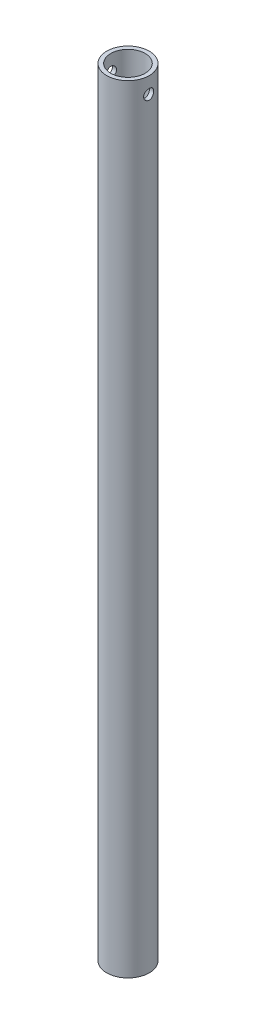
ISO-10303-21;
HEADER;
FILE_DESCRIPTION(('STEP AP214'),'2;1');
FILE_NAME('part.step','',(''),(''),'','','');
FILE_SCHEMA(('AUTOMOTIVE_DESIGN { 1 0 10303 214 1 1 1 1 }'));
ENDSEC;
DATA;
#1=APPLICATION_CONTEXT('core data for automotive mechanical design processes');
#2=APPLICATION_PROTOCOL_DEFINITION('international standard','automotive_design',2000,#1);
#3=PRODUCT_CONTEXT('',#1,'mechanical');
#4=PRODUCT('Part','Part','',(#3));
#5=PRODUCT_RELATED_PRODUCT_CATEGORY('part','',(#4));
#6=PRODUCT_DEFINITION_FORMATION('','',#4);
#7=PRODUCT_DEFINITION_CONTEXT('part definition',#1,'design');
#8=PRODUCT_DEFINITION('design','',#6,#7);
#9=PRODUCT_DEFINITION_SHAPE('','',#8);
#10=(LENGTH_UNIT() NAMED_UNIT(*) SI_UNIT(.MILLI.,.METRE.));
#11=(NAMED_UNIT(*) PLANE_ANGLE_UNIT() SI_UNIT($,.RADIAN.));
#12=(NAMED_UNIT(*) SI_UNIT($,.STERADIAN.) SOLID_ANGLE_UNIT());
#13=UNCERTAINTY_MEASURE_WITH_UNIT(LENGTH_MEASURE(1.E-05),#10,'distance_accuracy_value','');
#14=(GEOMETRIC_REPRESENTATION_CONTEXT(3) GLOBAL_UNCERTAINTY_ASSIGNED_CONTEXT((#13)) GLOBAL_UNIT_ASSIGNED_CONTEXT((#10,
#11,#12)) REPRESENTATION_CONTEXT('',''));
#15=CARTESIAN_POINT('',(0.,0.,0.));
#16=DIRECTION('',(0.,0.,1.));
#17=DIRECTION('',(1.,0.,0.));
#18=AXIS2_PLACEMENT_3D('',#15,#16,#17);
#19=CARTESIAN_POINT('',(0.,609.6,0.));
#20=DIRECTION('',(0.,-1.,0.));
#21=DIRECTION('',(0.,0.,-1.));
#22=AXIS2_PLACEMENT_3D('',#19,#20,#21);
#23=CYLINDRICAL_SURFACE('',#22,16.66875);
#24=CARTESIAN_POINT('',(0.,609.6,0.));
#25=DIRECTION('',(0.,1.,0.));
#26=DIRECTION('',(0.,0.,1.));
#27=AXIS2_PLACEMENT_3D('',#24,#25,#26);
#28=CIRCLE('',#27,16.66875);
#29=CARTESIAN_POINT('',(0.,609.6,16.66875));
#30=VERTEX_POINT('',#29);
#31=EDGE_CURVE('E10',#30,#30,#28,.T.);
#32=ORIENTED_EDGE('',*,*,#31,.F.);
#33=EDGE_LOOP('',(#32));
#34=FACE_BOUND('',#33,.T.);
#35=CARTESIAN_POINT('',(0.,0.,0.));
#36=DIRECTION('',(0.,1.,0.));
#37=DIRECTION('',(0.,0.,1.));
#38=AXIS2_PLACEMENT_3D('',#35,#36,#37);
#39=CIRCLE('',#38,16.66875);
#40=CARTESIAN_POINT('',(0.,0.,16.66875));
#41=VERTEX_POINT('',#40);
#42=EDGE_CURVE('E44',#41,#41,#39,.T.);
#43=ORIENTED_EDGE('',*,*,#42,.T.);
#44=EDGE_LOOP('',(#43));
#45=FACE_BOUND('',#44,.T.);
#46=CARTESIAN_POINT('',(-16.1893869556571,596.9,3.96874999999999));
#47=CARTESIAN_POINT('',(-16.1893913039694,597.119509138966,3.96874320187447));
#48=CARTESIAN_POINT('',(-16.193900092601,597.339095949009,3.95047662095431));
#49=CARTESIAN_POINT('',(-16.2114072036727,597.771987990475,3.87799482760028));
#50=CARTESIAN_POINT('',(-16.224410936394,597.985289128122,3.82375670518668));
#51=CARTESIAN_POINT('',(-16.2573535939761,598.399285688146,3.68116696825289));
#52=CARTESIAN_POINT('',(-16.277284097737,598.599996069328,3.59285676197682));
#53=CARTESIAN_POINT('',(-16.3218243007466,598.983767714436,3.38475299203812));
#54=CARTESIAN_POINT('',(-16.3464340837801,599.166828662252,3.26495886462595));
#55=CARTESIAN_POINT('',(-16.3981099437525,599.513762959826,2.99473337212103));
#56=CARTESIAN_POINT('',(-16.4252122416785,599.677231928507,2.84378966404885));
#57=CARTESIAN_POINT('',(-16.4785040589715,599.976787749384,2.5166543345214));
#58=CARTESIAN_POINT('',(-16.5046934987564,600.112872219135,2.34046051859421));
#59=CARTESIAN_POINT('',(-16.5536070855652,600.355428976585,1.96507927258675));
#60=CARTESIAN_POINT('',(-16.5762835021716,600.461507267769,1.76563050089719));
#61=CARTESIAN_POINT('',(-16.6152044070171,600.638483800886,1.35110443367567));
#62=CARTESIAN_POINT('',(-16.6314497535651,600.709386737743,1.1360292282298));
#63=CARTESIAN_POINT('',(-16.6554220885956,600.812713838594,0.700567166830818));
#64=CARTESIAN_POINT('',(-16.663300720919,600.84582384611,0.480351539849617));
#65=CARTESIAN_POINT('',(-16.6701791620199,600.874774685706,0.0373599159719877));
#66=CARTESIAN_POINT('',(-16.66918016612,600.870620535193,-0.185415732198095));
#67=CARTESIAN_POINT('',(-16.6585299872047,600.825661197348,-0.622458310421993));
#68=CARTESIAN_POINT('',(-16.6490534720449,600.785595879071,-0.836806243483198));
#69=CARTESIAN_POINT('',(-16.622714647105,600.671136698666,-1.25564506631625));
#70=CARTESIAN_POINT('',(-16.6058519657883,600.596741109658,-1.46013545966272));
#71=CARTESIAN_POINT('',(-16.566362857535,600.415112762414,-1.85544493993857));
#72=CARTESIAN_POINT('',(-16.5436893002388,600.30760997042,-2.04613505635982));
#73=CARTESIAN_POINT('',(-16.4950486784818,600.063022206679,-2.40703224887773));
#74=CARTESIAN_POINT('',(-16.4690810895867,599.925932522034,-2.57723605497414));
#75=CARTESIAN_POINT('',(-16.4159388375055,599.622071165898,-2.89673765614987));
#76=CARTESIAN_POINT('',(-16.3887501944136,599.454652417083,-3.04541833943176));
#77=CARTESIAN_POINT('',(-16.336820050432,599.096973391909,-3.31272277423931));
#78=CARTESIAN_POINT('',(-16.3120786432218,598.906712241766,-3.43134537542204));
#79=CARTESIAN_POINT('',(-16.2677989475134,598.50762365026,-3.63551269800721));
#80=CARTESIAN_POINT('',(-16.2482821219223,598.298724185156,-3.72092160620989));
#81=CARTESIAN_POINT('',(-16.2169441914395,597.868958142799,-3.85522429075744));
#82=CARTESIAN_POINT('',(-16.2051216115953,597.648093867946,-3.90412506581322));
#83=CARTESIAN_POINT('',(-16.1908170049581,597.20635758429,-3.96302610438424));
#84=CARTESIAN_POINT('',(-16.188117255765,596.985613413373,-3.97393330883585));
#85=CARTESIAN_POINT('',(-16.1917734400006,596.545460070858,-3.95900969993296));
#86=CARTESIAN_POINT('',(-16.1981286250799,596.326050790442,-3.93318192255887));
#87=CARTESIAN_POINT('',(-16.218971150064,595.898079290154,-3.84631356280958));
#88=CARTESIAN_POINT('',(-16.2333390904376,595.689405839453,-3.78578963251961));
#89=CARTESIAN_POINT('',(-16.2684770960753,595.285164038621,-3.63181448734691));
#90=CARTESIAN_POINT('',(-16.2892478640847,595.089597129873,-3.53835965795668));
#91=CARTESIAN_POINT('',(-16.33531744805,594.71324455203,-3.31923808079745));
#92=CARTESIAN_POINT('',(-16.3606909366282,594.532787717412,-3.19302258008508));
#93=CARTESIAN_POINT('',(-16.4129185095009,594.195282064995,-2.91266576127535));
#94=CARTESIAN_POINT('',(-16.4397728130794,594.038236726871,-2.75852029944565));
#95=CARTESIAN_POINT('',(-16.4926661509835,593.748399144301,-2.42253961732193));
#96=CARTESIAN_POINT('',(-16.5186733327086,593.616230768001,-2.2401602957868));
#97=CARTESIAN_POINT('',(-16.5663141058592,593.384402070726,-1.85526550103091));
#98=CARTESIAN_POINT('',(-16.5879479182715,593.284740107043,-1.65275104601206));
#99=CARTESIAN_POINT('',(-16.6242723128625,593.121575254231,-1.23469355882788));
#100=CARTESIAN_POINT('',(-16.6390107582733,593.057822456165,-1.0192524166005));
#101=CARTESIAN_POINT('',(-16.6600923892765,592.967521897732,-0.580321227017824));
#102=CARTESIAN_POINT('',(-16.6664370352183,592.940967665528,-0.356832586714426));
#103=CARTESIAN_POINT('',(-16.6699629861333,592.926153479183,0.0859651670735121));
#104=CARTESIAN_POINT('',(-16.6673655804266,592.936968764477,0.305242073104256));
#105=CARTESIAN_POINT('',(-16.6537834215515,592.99448811683,0.738757658403146));
#106=CARTESIAN_POINT('',(-16.642798876678,593.041191292611,0.952996462656539));
#107=CARTESIAN_POINT('',(-16.6137040048459,593.168684580464,1.3694855791003));
#108=CARTESIAN_POINT('',(-16.5956257128625,593.249321566301,1.5717851479128));
#109=CARTESIAN_POINT('',(-16.554257106068,593.442251681583,1.96009471458966));
#110=CARTESIAN_POINT('',(-16.5309661903573,593.554548461088,2.14610283096938));
#111=CARTESIAN_POINT('',(-16.4810542350619,593.810507998869,2.50098557153082));
#112=CARTESIAN_POINT('',(-16.4543711158269,593.954807485788,2.66939224485944));
#113=CARTESIAN_POINT('',(-16.4009820273245,594.269420806537,2.97991533377172));
#114=CARTESIAN_POINT('',(-16.3742760540323,594.439741080837,3.12202522126325));
#115=CARTESIAN_POINT('',(-16.3233674418405,594.804943623025,3.37820724795554));
#116=CARTESIAN_POINT('',(-16.2992133728001,595.000184761318,3.49177813155239));
#117=CARTESIAN_POINT('',(-16.2567784368234,595.407529441332,3.68431435823782));
#118=CARTESIAN_POINT('',(-16.2384930181336,595.619619754686,3.7633065381268));
#119=CARTESIAN_POINT('',(-16.2129336405371,596.009654634087,3.87174406553944));
#120=CARTESIAN_POINT('',(-16.2041668827364,596.185626857772,3.9080458952094));
#121=CARTESIAN_POINT('',(-16.192391961351,596.541048902203,3.95655080941673));
#122=CARTESIAN_POINT('',(-16.1893833998659,596.720498481794,3.96875555910271));
#123=CARTESIAN_POINT('',(-16.1893869556571,596.9,3.96874999999999));
#124=B_SPLINE_CURVE_WITH_KNOTS('',3,(#46,#47,#48,#49,#50,#51,#52,#53,#54,#55,#56,#57,#58,#59,
#60,#61,#62,#63,#64,#65,#66,#67,#68,#69,#70,#71,#72,#73,#74,#75,#76,#77,#78,#79,#80,#81,#82,#83,
#84,#85,#86,#87,#88,#89,#90,#91,#92,#93,#94,#95,#96,#97,#98,#99,#100,#101,#102,#103,#104,#105,
#106,#107,#108,#109,#110,#111,#112,#113,#114,#115,#116,#117,#118,#119,#120,#121,#122,#123),
.UNSPECIFIED.,.T.,.F.,(4,2,2,2,2,2,2,2,2,2,2,2,2,2,2,2,2,2,2,2,2,2,2,2,2,2,2,2,2,2,2,2,2,2,2,2,
2,2,4),(0.,0.657868779461489,1.316156953031,1.97364760776035,2.63115003628708,3.30047966623595,
3.96986750254462,4.64767500234941,5.32539200951323,5.99060427426692,6.65572697329564,
7.30745352003919,7.95921285349548,8.61643563569944,9.27376318428535,9.94725702561397,
10.6207766381115,11.297022067479,11.9731378254006,12.632999141662,13.2928059265329,
13.9430338419582,14.5933331488789,15.255320211521,15.9174055681281,16.5943597100004,
17.2712796367647,17.9434284289527,18.6154602656206,19.2709820870444,19.9264876290886,
20.5790663962662,21.2317204300525,21.898758265315,22.5659614690678,23.2441723705682,
23.9218559700471,24.4598591083636,24.9978250684599),.UNSPECIFIED.);
#125=CARTESIAN_POINT('',(-16.1893869556571,596.9,3.96874999999999));
#126=VERTEX_POINT('',#125);
#127=EDGE_CURVE('E72',#126,#126,#124,.T.);
#128=ORIENTED_EDGE('',*,*,#127,.F.);
#129=EDGE_LOOP('',(#128));
#130=FACE_BOUND('',#129,.T.);
#131=CARTESIAN_POINT('',(16.1893869556571,596.9,3.96874999999999));
#132=CARTESIAN_POINT('',(16.1893913039694,596.680490861034,3.96874320187447));
#133=CARTESIAN_POINT('',(16.193900092601,596.460904050991,3.95047662095431));
#134=CARTESIAN_POINT('',(16.2114072036728,596.028012009525,3.87799482760028));
#135=CARTESIAN_POINT('',(16.224410936394,595.814710871878,3.82375670518668));
#136=CARTESIAN_POINT('',(16.2573535939761,595.400714311854,3.68116696825289));
#137=CARTESIAN_POINT('',(16.277284097737,595.200003930672,3.59285676197682));
#138=CARTESIAN_POINT('',(16.3218243007466,594.816232285564,3.38475299203812));
#139=CARTESIAN_POINT('',(16.3464340837801,594.633171337748,3.26495886462595));
#140=CARTESIAN_POINT('',(16.3981099437525,594.286237040174,2.99473337212103));
#141=CARTESIAN_POINT('',(16.4252122416785,594.122768071493,2.84378966404885));
#142=CARTESIAN_POINT('',(16.4785040589715,593.823212250616,2.5166543345214));
#143=CARTESIAN_POINT('',(16.5046934987564,593.687127780865,2.34046051859421));
#144=CARTESIAN_POINT('',(16.5536070855652,593.444571023415,1.96507927258675));
#145=CARTESIAN_POINT('',(16.5762835021716,593.338492732231,1.76563050089719));
#146=CARTESIAN_POINT('',(16.6152044070171,593.161516199114,1.35110443367567));
#147=CARTESIAN_POINT('',(16.6314497535651,593.090613262257,1.1360292282298));
#148=CARTESIAN_POINT('',(16.6554220885956,592.987286161406,0.700567166830818));
#149=CARTESIAN_POINT('',(16.663300720919,592.95417615389,0.480351539849617));
#150=CARTESIAN_POINT('',(16.6701791620199,592.925225314294,0.0373599159719883));
#151=CARTESIAN_POINT('',(16.66918016612,592.929379464807,-0.185415732198094));
#152=CARTESIAN_POINT('',(16.6585299872047,592.974338802651,-0.622458310421993));
#153=CARTESIAN_POINT('',(16.6490534720449,593.014404120929,-0.836806243483198));
#154=CARTESIAN_POINT('',(16.622714647105,593.128863301334,-1.25564506631625));
#155=CARTESIAN_POINT('',(16.6058519657883,593.203258890342,-1.46013545966272));
#156=CARTESIAN_POINT('',(16.566362857535,593.384887237586,-1.85544493993857));
#157=CARTESIAN_POINT('',(16.5436893002388,593.49239002958,-2.04613505635982));
#158=CARTESIAN_POINT('',(16.4950486784818,593.736977793321,-2.40703224887773));
#159=CARTESIAN_POINT('',(16.4690810895867,593.874067477965,-2.57723605497414));
#160=CARTESIAN_POINT('',(16.4159388375055,594.177928834102,-2.89673765614987));
#161=CARTESIAN_POINT('',(16.3887501944136,594.345347582917,-3.04541833943176));
#162=CARTESIAN_POINT('',(16.336820050432,594.703026608091,-3.31272277423931));
#163=CARTESIAN_POINT('',(16.3120786432218,594.893287758234,-3.43134537542204));
#164=CARTESIAN_POINT('',(16.2677989475134,595.29237634974,-3.63551269800722));
#165=CARTESIAN_POINT('',(16.2482821219223,595.501275814844,-3.72092160620992));
#166=CARTESIAN_POINT('',(16.2169441914395,595.931041857201,-3.85522429075746));
#167=CARTESIAN_POINT('',(16.2051216115953,596.151906132054,-3.90412506581323));
#168=CARTESIAN_POINT('',(16.1908170049581,596.59364241571,-3.96302610438424));
#169=CARTESIAN_POINT('',(16.188117255765,596.814386586627,-3.97393330883585));
#170=CARTESIAN_POINT('',(16.1917734400006,597.254539929142,-3.95900969993296));
#171=CARTESIAN_POINT('',(16.1981286250799,597.473949209558,-3.93318192255887));
#172=CARTESIAN_POINT('',(16.218971150064,597.901920709846,-3.84631356280957));
#173=CARTESIAN_POINT('',(16.2333390904376,598.110594160547,-3.78578963251959));
#174=CARTESIAN_POINT('',(16.2684770960753,598.514835961379,-3.63181448734688));
#175=CARTESIAN_POINT('',(16.2892478640847,598.710402870127,-3.53835965795666));
#176=CARTESIAN_POINT('',(16.33531744805,599.08675544797,-3.31923808079744));
#177=CARTESIAN_POINT('',(16.3606909366282,599.267212282588,-3.19302258008508));
#178=CARTESIAN_POINT('',(16.4129185095009,599.604717935005,-2.91266576127535));
#179=CARTESIAN_POINT('',(16.4397728130794,599.761763273129,-2.75852029944565));
#180=CARTESIAN_POINT('',(16.4926661509835,600.051600855699,-2.42253961732193));
#181=CARTESIAN_POINT('',(16.5186733327086,600.183769231999,-2.2401602957868));
#182=CARTESIAN_POINT('',(16.5663141058592,600.415597929274,-1.85526550103091));
#183=CARTESIAN_POINT('',(16.5879479182715,600.515259892957,-1.65275104601206));
#184=CARTESIAN_POINT('',(16.6242723128625,600.678424745769,-1.23469355882788));
#185=CARTESIAN_POINT('',(16.6390107582733,600.742177543835,-1.0192524166005));
#186=CARTESIAN_POINT('',(16.6600923892765,600.832478102268,-0.580321227017824));
#187=CARTESIAN_POINT('',(16.6664370352183,600.859032334472,-0.356832586714425));
#188=CARTESIAN_POINT('',(16.6699629861333,600.873846520817,0.0859651670735123));
#189=CARTESIAN_POINT('',(16.6673655804266,600.863031235523,0.305242073104256));
#190=CARTESIAN_POINT('',(16.6537834215515,600.80551188317,0.738757658403146));
#191=CARTESIAN_POINT('',(16.642798876678,600.758808707389,0.952996462656539));
#192=CARTESIAN_POINT('',(16.6137040048459,600.631315419536,1.3694855791003));
#193=CARTESIAN_POINT('',(16.5956257128625,600.550678433699,1.5717851479128));
#194=CARTESIAN_POINT('',(16.554257106068,600.357748318416,1.96009471458966));
#195=CARTESIAN_POINT('',(16.5309661903573,600.245451538912,2.14610283096938));
#196=CARTESIAN_POINT('',(16.4810542350619,599.989492001131,2.50098557153082));
#197=CARTESIAN_POINT('',(16.4543711158269,599.845192514212,2.66939224485944));
#198=CARTESIAN_POINT('',(16.4009820273245,599.530579193463,2.97991533377172));
#199=CARTESIAN_POINT('',(16.3742760540323,599.360258919163,3.12202522126325));
#200=CARTESIAN_POINT('',(16.3233674418405,598.995056376975,3.37820724795554));
#201=CARTESIAN_POINT('',(16.2992133728001,598.799815238682,3.49177813155239));
#202=CARTESIAN_POINT('',(16.2567784368234,598.392470558668,3.68431435823782));
#203=CARTESIAN_POINT('',(16.2384930181336,598.180380245314,3.7633065381268));
#204=CARTESIAN_POINT('',(16.2129336405371,597.790345365913,3.87174406553943));
#205=CARTESIAN_POINT('',(16.2041668827364,597.614373142228,3.90804589520939));
#206=CARTESIAN_POINT('',(16.192391961351,597.258951097797,3.95655080941672));
#207=CARTESIAN_POINT('',(16.1893833998659,597.079501518206,3.96875555910271));
#208=CARTESIAN_POINT('',(16.1893869556571,596.9,3.96874999999999));
#209=B_SPLINE_CURVE_WITH_KNOTS('',3,(#131,#132,#133,#134,#135,#136,#137,#138,#139,#140,#141,
#142,#143,#144,#145,#146,#147,#148,#149,#150,#151,#152,#153,#154,#155,#156,#157,#158,#159,#160,
#161,#162,#163,#164,#165,#166,#167,#168,#169,#170,#171,#172,#173,#174,#175,#176,#177,#178,#179,
#180,#181,#182,#183,#184,#185,#186,#187,#188,#189,#190,#191,#192,#193,#194,#195,#196,#197,#198,
#199,#200,#201,#202,#203,#204,#205,#206,#207,#208),.UNSPECIFIED.,.T.,.F.,(4,2,2,2,2,2,2,2,2,2,2,
2,2,2,2,2,2,2,2,2,2,2,2,2,2,2,2,2,2,2,2,2,2,2,2,2,2,2,4),(0.,0.657868779461489,1.316156953031,
1.97364760776035,2.63115003628708,3.30047966623595,3.96986750254462,4.64767500234941,
5.32539200951323,5.99060427426692,6.65572697329564,7.30745352003919,7.95921285349548,
8.61643563569944,9.27376318428535,9.94725702561397,10.6207766381115,11.2970220674791,
11.9731378254006,12.6329991416619,13.2928059265329,13.9430338419583,14.5933331488789,
15.255320211521,15.9174055681281,16.5943597100004,17.2712796367647,17.9434284289527,
18.6154602656206,19.2709820870444,19.9264876290886,20.5790663962662,21.2317204300525,
21.898758265315,22.5659614690678,23.2441723705682,23.9218559700471,24.4598591083634,
24.9978250684599),.UNSPECIFIED.);
#210=CARTESIAN_POINT('',(16.1893869556571,596.9,3.96874999999999));
#211=VERTEX_POINT('',#210);
#212=EDGE_CURVE('E77',#211,#211,#209,.T.);
#213=ORIENTED_EDGE('',*,*,#212,.F.);
#214=EDGE_LOOP('',(#213));
#215=FACE_BOUND('',#214,.T.);
#216=ADVANCED_FACE('F31',(#34,#45,#130,#215),#23,.T.);
#217=CARTESIAN_POINT('',(0.,609.6,0.));
#218=DIRECTION('',(0.,-1.,0.));
#219=DIRECTION('',(0.,0.,-1.));
#220=AXIS2_PLACEMENT_3D('',#217,#218,#219);
#221=CYLINDRICAL_SURFACE('',#220,13.49375);
#222=CARTESIAN_POINT('',(-12.8969109673596,596.9,3.96874999999999));
#223=CARTESIAN_POINT('',(-12.8969135757376,597.117687758627,3.96874676525359));
#224=CARTESIAN_POINT('',(-12.9024828229111,597.335407716338,3.95077864824026));
#225=CARTESIAN_POINT('',(-12.9240733024968,597.764496646878,3.87955690784989));
#226=CARTESIAN_POINT('',(-12.9400983406899,597.975863277857,3.82629043619005));
#227=CARTESIAN_POINT('',(-12.980631856942,598.385972765027,3.68642561256911));
#228=CARTESIAN_POINT('',(-13.0051266268461,598.584735409197,3.59988109550326));
#229=CARTESIAN_POINT('',(-13.0598213153262,598.964966077318,3.39609239059901));
#230=CARTESIAN_POINT('',(-13.090022015077,599.146431728088,3.2788439983734));
#231=CARTESIAN_POINT('',(-13.1537558286523,599.492436858201,3.01315822457902));
#232=CARTESIAN_POINT('',(-13.187357820376,599.656372412924,2.86395069232767));
#233=CARTESIAN_POINT('',(-13.2535186381234,599.957292343641,2.54023364484507));
#234=CARTESIAN_POINT('',(-13.2860773347162,600.094273386423,2.3657210049963));
#235=CARTESIAN_POINT('',(-13.3472629405691,600.339999083879,1.99207127191436));
#236=CARTESIAN_POINT('',(-13.3757992118533,600.448130799517,1.79251494808595));
#237=CARTESIAN_POINT('',(-13.4249262983536,600.629069063295,1.37706994878709));
#238=CARTESIAN_POINT('',(-13.4455187571649,600.701882919593,1.16118466288854));
#239=CARTESIAN_POINT('',(-13.4759507145952,600.808128098014,0.725525609268526));
#240=CARTESIAN_POINT('',(-13.4860709604196,600.842589631708,0.506023044797725));
#241=CARTESIAN_POINT('',(-13.4954055960329,600.87440646271,0.0641340385014437));
#242=CARTESIAN_POINT('',(-13.4946221904556,600.871769261094,-0.158251811261482));
#243=CARTESIAN_POINT('',(-13.4824375849886,600.830161274496,-0.592377756116062));
#244=CARTESIAN_POINT('',(-13.4713622731322,600.792305621884,-0.804235308489671));
#245=CARTESIAN_POINT('',(-13.4402322141025,600.68315318123,-1.21844568788541));
#246=CARTESIAN_POINT('',(-13.4201769070886,600.611854308221,-1.42079792144759));
#247=CARTESIAN_POINT('',(-13.3728837518511,600.437066283411,-1.81294025792372));
#248=CARTESIAN_POINT('',(-13.3455669130679,600.333220719208,-2.00256157976797));
#249=CARTESIAN_POINT('',(-13.2866568037583,600.096567368308,-2.36204793028639));
#250=CARTESIAN_POINT('',(-13.2550625511069,599.963752925857,-2.53190840502528));
#251=CARTESIAN_POINT('',(-13.1896029741631,599.667122609516,-2.8537075939966));
#252=CARTESIAN_POINT('',(-13.1556968805335,599.502339166732,-3.00474729143895));
#253=CARTESIAN_POINT('',(-13.0904662335038,599.149446916211,-3.27729680709275));
#254=CARTESIAN_POINT('',(-13.0591419165418,598.961335976091,-3.39880392270185));
#255=CARTESIAN_POINT('',(-13.0024319531931,598.564839582279,-3.60972841893817));
#256=CARTESIAN_POINT('',(-12.9771016515036,598.356288561374,-3.69885052715089));
#257=CARTESIAN_POINT('',(-12.93590882797,597.926222701708,-3.84044944703012));
#258=CARTESIAN_POINT('',(-12.9200433582247,597.704711923,-3.89293766949394));
#259=CARTESIAN_POINT('',(-12.9002201275482,597.263543862422,-3.95812281484467));
#260=CARTESIAN_POINT('',(-12.8958550088916,597.04410594119,-3.97218166366043));
#261=CARTESIAN_POINT('',(-12.8984024380303,596.606003289338,-3.96390295098303));
#262=CARTESIAN_POINT('',(-12.9053134798314,596.387338459376,-3.94157024978532));
#263=CARTESIAN_POINT('',(-12.9292358437646,595.962588005237,-3.86235318244453));
#264=CARTESIAN_POINT('',(-12.945993731058,595.756325124025,-3.80633498488566));
#265=CARTESIAN_POINT('',(-12.9874617644947,595.356136243918,-3.66233573730749));
#266=CARTESIAN_POINT('',(-13.0121731054812,595.162212103912,-3.57434988454826));
#267=CARTESIAN_POINT('',(-13.0675620801825,594.786637090718,-3.36629664482471));
#268=CARTESIAN_POINT('',(-13.0983780151269,594.605435854146,-3.24545530686254));
#269=CARTESIAN_POINT('',(-13.1622018784308,594.26538506946,-2.97604771830021));
#270=CARTESIAN_POINT('',(-13.1952103096821,594.106540675564,-2.82747509274438));
#271=CARTESIAN_POINT('',(-13.2611410553919,593.809811938137,-2.50043817250169));
#272=CARTESIAN_POINT('',(-13.2940173116657,593.672890372726,-2.32108893445077));
#273=CARTESIAN_POINT('',(-13.3547762456756,593.431069898414,-1.9411825492688));
#274=CARTESIAN_POINT('',(-13.3826591778157,593.326169357887,-1.74062648342952));
#275=CARTESIAN_POINT('',(-13.4301160068054,593.152378392259,-1.3253556500168));
#276=CARTESIAN_POINT('',(-13.4497522516455,593.083216814547,-1.11076184269224));
#277=CARTESIAN_POINT('',(-13.4787786606013,592.982151515806,-0.672319535792945));
#278=CARTESIAN_POINT('',(-13.4881716320886,592.950237586154,-0.448473589414868));
#279=CARTESIAN_POINT('',(-13.4954892331482,592.925325212023,-0.00679550433907685));
#280=CARTESIAN_POINT('',(-13.4938261458075,592.930927824836,0.210951902196402));
#281=CARTESIAN_POINT('',(-13.4801829682447,592.977562960569,0.642270557956199));
#282=CARTESIAN_POINT('',(-13.4682034243861,593.018593607208,0.85584202772715));
#283=CARTESIAN_POINT('',(-13.4353846659536,593.134066787928,1.27068272353851));
#284=CARTESIAN_POINT('',(-13.4146349716783,593.20817213226,1.47205337251849));
#285=CARTESIAN_POINT('',(-13.3664249215142,593.387390416619,1.85961096669906));
#286=CARTESIAN_POINT('',(-13.3389634881803,593.492508335701,2.04579546763877));
#287=CARTESIAN_POINT('',(-13.2791634190896,593.734559206335,2.40398081215325));
#288=CARTESIAN_POINT('',(-13.2466997471526,593.872379265649,2.57536114581196));
#289=CARTESIAN_POINT('',(-13.1809721659725,594.174309276919,2.89303107980818));
#290=CARTESIAN_POINT('',(-13.1477080324999,594.338426670017,3.03931355407652));
#291=CARTESIAN_POINT('',(-13.0830411309621,594.693872352256,3.30678538024603));
#292=CARTESIAN_POINT('',(-13.0517177317637,594.885839515338,3.42714698326061));
#293=CARTESIAN_POINT('',(-12.9957200014392,595.28817612272,3.6337413254889));
#294=CARTESIAN_POINT('',(-12.9710422544203,595.498536039124,3.71999160878814));
#295=CARTESIAN_POINT('',(-12.9337563350434,595.906055226644,3.84748066818838));
#296=CARTESIAN_POINT('',(-12.9200662702076,596.101835547005,3.89283496850558));
#297=CARTESIAN_POINT('',(-12.9016431972483,596.498402055785,3.9534683933184));
#298=CARTESIAN_POINT('',(-12.8969085611822,596.699187327666,3.96875298398987));
#299=CARTESIAN_POINT('',(-12.8969109673596,596.9,3.96874999999999));
#300=B_SPLINE_CURVE_WITH_KNOTS('',3,(#222,#223,#224,#225,#226,#227,#228,#229,#230,#231,#232,
#233,#234,#235,#236,#237,#238,#239,#240,#241,#242,#243,#244,#245,#246,#247,#248,#249,#250,#251,
#252,#253,#254,#255,#256,#257,#258,#259,#260,#261,#262,#263,#264,#265,#266,#267,#268,#269,#270,
#271,#272,#273,#274,#275,#276,#277,#278,#279,#280,#281,#282,#283,#284,#285,#286,#287,#288,#289,
#290,#291,#292,#293,#294,#295,#296,#297,#298,#299),.UNSPECIFIED.,.T.,.F.,(4,2,2,2,2,2,2,2,2,2,2,
2,2,2,2,2,2,2,2,2,2,2,2,2,2,2,2,2,2,2,2,2,2,2,2,2,2,2,4),(0.,0.652322958556518,1.30488348730344,
1.95639276066186,2.60799129411814,3.27753835935901,3.94716816927112,4.63005976275925,
5.31280998835544,5.97674101257177,6.64053779703141,7.28400684221363,7.92751600881961,
8.57833400661711,9.22930169113959,9.90442713929168,10.5796143466635,11.2608116898993,
11.9417967575923,12.5983143156216,13.2547441992382,13.8949765123361,14.5353050521239,
15.192266061881,15.8493782823233,16.5301942718333,17.210975564684,17.8865129755537,
18.5618651954621,19.2121783887166,19.8624571432525,20.5062527183753,21.150151710889,
21.8140589308716,22.4781543440921,23.1610527579856,23.8435994863535,24.4454639943241,
25.0472190831688),.UNSPECIFIED.);
#301=CARTESIAN_POINT('',(-12.8969109673596,596.9,3.96874999999999));
#302=VERTEX_POINT('',#301);
#303=EDGE_CURVE('E54',#302,#302,#300,.T.);
#304=ORIENTED_EDGE('',*,*,#303,.T.);
#305=EDGE_LOOP('',(#304));
#306=FACE_BOUND('',#305,.T.);
#307=CARTESIAN_POINT('',(0.,609.6,0.));
#308=DIRECTION('',(0.,1.,0.));
#309=DIRECTION('',(0.,0.,1.));
#310=AXIS2_PLACEMENT_3D('',#307,#308,#309);
#311=CIRCLE('',#310,13.49375);
#312=CARTESIAN_POINT('',(0.,609.6,13.49375));
#313=VERTEX_POINT('',#312);
#314=EDGE_CURVE('E49',#313,#313,#311,.T.);
#315=ORIENTED_EDGE('',*,*,#314,.T.);
#316=EDGE_LOOP('',(#315));
#317=FACE_BOUND('',#316,.T.);
#318=CARTESIAN_POINT('',(0.,0.,0.));
#319=DIRECTION('',(0.,1.,0.));
#320=DIRECTION('',(0.,0.,1.));
#321=AXIS2_PLACEMENT_3D('',#318,#319,#320);
#322=CIRCLE('',#321,13.49375);
#323=CARTESIAN_POINT('',(0.,0.,13.49375));
#324=VERTEX_POINT('',#323);
#325=EDGE_CURVE('E52',#324,#324,#322,.T.);
#326=ORIENTED_EDGE('',*,*,#325,.F.);
#327=EDGE_LOOP('',(#326));
#328=FACE_BOUND('',#327,.T.);
#329=CARTESIAN_POINT('',(12.8969109673596,596.9,3.96874999999999));
#330=CARTESIAN_POINT('',(12.8969135757376,596.682312241373,3.96874676525359));
#331=CARTESIAN_POINT('',(12.9024828229111,596.464592283662,3.95077864824026));
#332=CARTESIAN_POINT('',(12.9240733024968,596.035503353122,3.8795569078499));
#333=CARTESIAN_POINT('',(12.9400983406899,595.824136722143,3.82629043619006));
#334=CARTESIAN_POINT('',(12.980631856942,595.414027234973,3.68642561256911));
#335=CARTESIAN_POINT('',(13.0051266268461,595.215264590803,3.59988109550326));
#336=CARTESIAN_POINT('',(13.0598213153262,594.835033922682,3.39609239059901));
#337=CARTESIAN_POINT('',(13.090022015077,594.653568271912,3.2788439983734));
#338=CARTESIAN_POINT('',(13.1537558286523,594.307563141798,3.01315822457902));
#339=CARTESIAN_POINT('',(13.187357820376,594.143627587076,2.86395069232767));
#340=CARTESIAN_POINT('',(13.2535186381234,593.842707656359,2.54023364484507));
#341=CARTESIAN_POINT('',(13.2860773347162,593.705726613577,2.3657210049963));
#342=CARTESIAN_POINT('',(13.3472629405691,593.460000916121,1.99207127191436));
#343=CARTESIAN_POINT('',(13.3757992118533,593.351869200483,1.79251494808595));
#344=CARTESIAN_POINT('',(13.4249262983536,593.170930936706,1.37706994878709));
#345=CARTESIAN_POINT('',(13.4455187571649,593.098117080406,1.16118466288854));
#346=CARTESIAN_POINT('',(13.4759507145952,592.991871901986,0.725525609268527));
#347=CARTESIAN_POINT('',(13.4860709604196,592.957410368292,0.506023044797727));
#348=CARTESIAN_POINT('',(13.4954055960329,592.92559353729,0.0641340385014447));
#349=CARTESIAN_POINT('',(13.4946221904556,592.928230738906,-0.158251811261481));
#350=CARTESIAN_POINT('',(13.4824375849886,592.969838725504,-0.59237775611606));
#351=CARTESIAN_POINT('',(13.4713622731322,593.007694378116,-0.80423530848967));
#352=CARTESIAN_POINT('',(13.4402322141025,593.11684681877,-1.21844568788541));
#353=CARTESIAN_POINT('',(13.4201769070886,593.188145691779,-1.42079792144759));
#354=CARTESIAN_POINT('',(13.3728837518511,593.362933716589,-1.81294025792372));
#355=CARTESIAN_POINT('',(13.3455669130679,593.466779280792,-2.00256157976797));
#356=CARTESIAN_POINT('',(13.2866568037583,593.703432631692,-2.36204793028639));
#357=CARTESIAN_POINT('',(13.2550625511069,593.836247074143,-2.53190840502528));
#358=CARTESIAN_POINT('',(13.1896029741631,594.132877390484,-2.8537075939966));
#359=CARTESIAN_POINT('',(13.1556968805335,594.297660833268,-3.00474729143895));
#360=CARTESIAN_POINT('',(13.0904662335038,594.650553083789,-3.27729680709275));
#361=CARTESIAN_POINT('',(13.0591419165418,594.838664023909,-3.39880392270185));
#362=CARTESIAN_POINT('',(13.0024319531931,595.235160417721,-3.60972841893817));
#363=CARTESIAN_POINT('',(12.9771016515036,595.443711438626,-3.69885052715089));
#364=CARTESIAN_POINT('',(12.93590882797,595.873777298292,-3.84044944703012));
#365=CARTESIAN_POINT('',(12.9200433582247,596.095288077,-3.89293766949394));
#366=CARTESIAN_POINT('',(12.9002201275482,596.536456137578,-3.95812281484467));
#367=CARTESIAN_POINT('',(12.8958550088916,596.75589405881,-3.97218166366043));
#368=CARTESIAN_POINT('',(12.8984024380303,597.193996710662,-3.96390295098303));
#369=CARTESIAN_POINT('',(12.9053134798314,597.412661540624,-3.94157024978532));
#370=CARTESIAN_POINT('',(12.9292358437646,597.837411994763,-3.86235318244454));
#371=CARTESIAN_POINT('',(12.945993731058,598.043674875975,-3.80633498488566));
#372=CARTESIAN_POINT('',(12.9874617644947,598.443863756082,-3.66233573730749));
#373=CARTESIAN_POINT('',(13.0121731054812,598.637787896088,-3.57434988454825));
#374=CARTESIAN_POINT('',(13.0675620801825,599.013362909282,-3.36629664482472));
#375=CARTESIAN_POINT('',(13.0983780151269,599.194564145854,-3.24545530686258));
#376=CARTESIAN_POINT('',(13.1622018784308,599.534614930541,-2.97604771830026));
#377=CARTESIAN_POINT('',(13.1952103096821,599.693459324436,-2.8274750927444));
#378=CARTESIAN_POINT('',(13.2611410553919,599.990188061863,-2.50043817250169));
#379=CARTESIAN_POINT('',(13.2940173116657,600.127109627274,-2.32108893445077));
#380=CARTESIAN_POINT('',(13.3547762456756,600.368930101586,-1.9411825492688));
#381=CARTESIAN_POINT('',(13.3826591778157,600.473830642113,-1.74062648342952));
#382=CARTESIAN_POINT('',(13.4301160068054,600.647621607741,-1.3253556500168));
#383=CARTESIAN_POINT('',(13.4497522516455,600.716783185453,-1.11076184269224));
#384=CARTESIAN_POINT('',(13.4787786606013,600.817848484194,-0.672319535792946));
#385=CARTESIAN_POINT('',(13.4881716320886,600.849762413846,-0.448473589414869));
#386=CARTESIAN_POINT('',(13.4954892331482,600.874674787977,-0.00679550433907788));
#387=CARTESIAN_POINT('',(13.4938261458075,600.869072175164,0.210951902196401));
#388=CARTESIAN_POINT('',(13.4801829682447,600.822437039431,0.642270557956198));
#389=CARTESIAN_POINT('',(13.4682034243861,600.781406392791,0.855842027727148));
#390=CARTESIAN_POINT('',(13.4353846659536,600.665933212072,1.27068272353851));
#391=CARTESIAN_POINT('',(13.4146349716783,600.59182786774,1.47205337251849));
#392=CARTESIAN_POINT('',(13.3664249215142,600.412609583381,1.85961096669905));
#393=CARTESIAN_POINT('',(13.3389634881803,600.307491664299,2.04579546763876));
#394=CARTESIAN_POINT('',(13.2791634190896,600.065440793665,2.40398081215327));
#395=CARTESIAN_POINT('',(13.2466997471526,599.927620734351,2.57536114581201));
#396=CARTESIAN_POINT('',(13.1809721659724,599.625690723081,2.89303107980822));
#397=CARTESIAN_POINT('',(13.1477080324999,599.461573329983,3.03931355407653));
#398=CARTESIAN_POINT('',(13.0830411309621,599.106127647744,3.30678538024602));
#399=CARTESIAN_POINT('',(13.0517177317637,598.914160484662,3.42714698326061));
#400=CARTESIAN_POINT('',(12.9957200014392,598.51182387728,3.6337413254889));
#401=CARTESIAN_POINT('',(12.9710422544203,598.301463960876,3.71999160878814));
#402=CARTESIAN_POINT('',(12.9337563350434,597.893944773356,3.84748066818838));
#403=CARTESIAN_POINT('',(12.9200662702076,597.698164452995,3.89283496850558));
#404=CARTESIAN_POINT('',(12.9016431972483,597.301597944215,3.9534683933184));
#405=CARTESIAN_POINT('',(12.8969085611822,597.100812672334,3.96875298398987));
#406=CARTESIAN_POINT('',(12.8969109673596,596.9,3.96874999999999));
#407=B_SPLINE_CURVE_WITH_KNOTS('',3,(#329,#330,#331,#332,#333,#334,#335,#336,#337,#338,#339,
#340,#341,#342,#343,#344,#345,#346,#347,#348,#349,#350,#351,#352,#353,#354,#355,#356,#357,#358,
#359,#360,#361,#362,#363,#364,#365,#366,#367,#368,#369,#370,#371,#372,#373,#374,#375,#376,#377,
#378,#379,#380,#381,#382,#383,#384,#385,#386,#387,#388,#389,#390,#391,#392,#393,#394,#395,#396,
#397,#398,#399,#400,#401,#402,#403,#404,#405,#406),.UNSPECIFIED.,.T.,.F.,(4,2,2,2,2,2,2,2,2,2,2,
2,2,2,2,2,2,2,2,2,2,2,2,2,2,2,2,2,2,2,2,2,2,2,2,2,2,2,4),(0.,0.652322958556406,1.30488348730344,
1.95639276066186,2.60799129411814,3.27753835935901,3.94716816927112,4.63005976275925,
5.31280998835544,5.97674101257177,6.64053779703141,7.28400684221363,7.92751600881961,
8.57833400661711,9.22930169113959,9.90442713929168,10.5796143466635,11.2608116898993,
11.9417967575923,12.5983143156216,13.2547441992382,13.8949765123361,14.5353050521239,
15.192266061881,15.8493782823233,16.5301942718333,17.2109755646841,17.8865129755537,
18.5618651954621,19.2121783887166,19.8624571432525,20.5062527183754,21.150151710889,
21.8140589308717,22.4781543440922,23.1610527579857,23.8435994863535,24.4454639943241,
25.0472190831688),.UNSPECIFIED.);
#408=CARTESIAN_POINT('',(12.8969109673596,596.9,3.96874999999999));
#409=VERTEX_POINT('',#408);
#410=EDGE_CURVE('E35',#409,#409,#407,.T.);
#411=ORIENTED_EDGE('',*,*,#410,.T.);
#412=EDGE_LOOP('',(#411));
#413=FACE_BOUND('',#412,.T.);
#414=ADVANCED_FACE('F59',(#306,#317,#328,#413),#221,.F.);
#415=CARTESIAN_POINT('',(0.,609.6,0.));
#416=DIRECTION('',(0.,1.,0.));
#417=DIRECTION('',(0.,0.,1.));
#418=AXIS2_PLACEMENT_3D('',#415,#416,#417);
#419=PLANE('',#418);
#420=ORIENTED_EDGE('',*,*,#31,.T.);
#421=EDGE_LOOP('',(#420));
#422=FACE_BOUND('',#421,.T.);
#423=ORIENTED_EDGE('',*,*,#314,.F.);
#424=EDGE_LOOP('',(#423));
#425=FACE_BOUND('',#424,.T.);
#426=ADVANCED_FACE('F92',(#422,#425),#419,.T.);
#427=CARTESIAN_POINT('',(0.,0.,0.));
#428=DIRECTION('',(0.,1.,0.));
#429=DIRECTION('',(0.,0.,1.));
#430=AXIS2_PLACEMENT_3D('',#427,#428,#429);
#431=PLANE('',#430);
#432=ORIENTED_EDGE('',*,*,#42,.F.);
#433=EDGE_LOOP('',(#432));
#434=FACE_BOUND('',#433,.T.);
#435=ORIENTED_EDGE('',*,*,#325,.T.);
#436=EDGE_LOOP('',(#435));
#437=FACE_BOUND('',#436,.T.);
#438=ADVANCED_FACE('F88',(#434,#437),#431,.F.);
#439=CARTESIAN_POINT('',(25.4,596.9,0.));
#440=DIRECTION('',(-1.,0.,0.));
#441=DIRECTION('',(0.,0.,1.));
#442=AXIS2_PLACEMENT_3D('',#439,#440,#441);
#443=CYLINDRICAL_SURFACE('',#442,3.96874999999999);
#444=ORIENTED_EDGE('',*,*,#303,.F.);
#445=EDGE_LOOP('',(#444));
#446=FACE_BOUND('',#445,.T.);
#447=ORIENTED_EDGE('',*,*,#127,.T.);
#448=EDGE_LOOP('',(#447));
#449=FACE_BOUND('',#448,.T.);
#450=ADVANCED_FACE('F65',(#446,#449),#443,.F.);
#451=ORIENTED_EDGE('',*,*,#410,.F.);
#452=EDGE_LOOP('',(#451));
#453=FACE_BOUND('',#452,.T.);
#454=ORIENTED_EDGE('',*,*,#212,.T.);
#455=EDGE_LOOP('',(#454));
#456=FACE_BOUND('',#455,.T.);
#457=ADVANCED_FACE('F62',(#453,#456),#443,.F.);
#458=CLOSED_SHELL('',(#216,#414,#426,#438,#450,#457));
#459=MANIFOLD_SOLID_BREP('B2',#458);
#460=ADVANCED_BREP_SHAPE_REPRESENTATION('',(#18,#459),#14);
#461=SHAPE_DEFINITION_REPRESENTATION(#9,#460);
ENDSEC;
END-ISO-10303-21;
